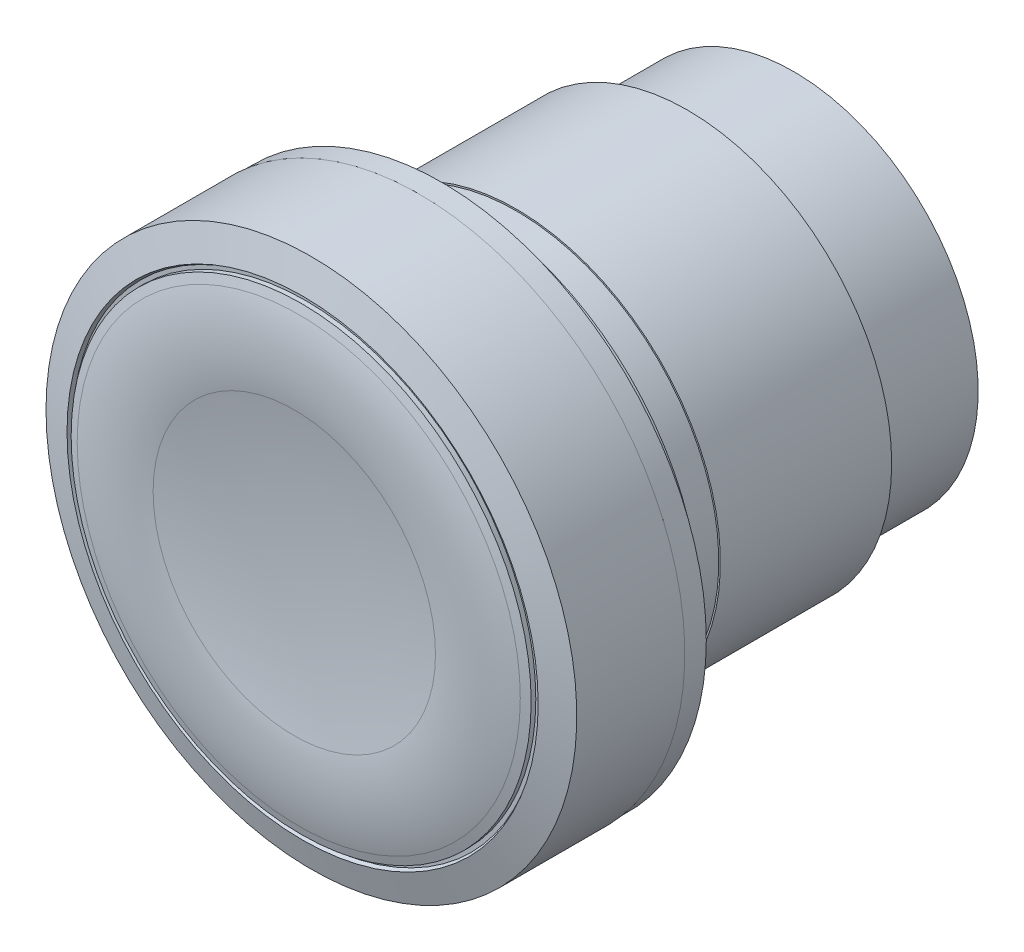
ISO-10303-21;
HEADER;
FILE_DESCRIPTION(('STEP AP214'),'2;1');
FILE_NAME('part.step','',(''),(''),'','','');
FILE_SCHEMA(('AUTOMOTIVE_DESIGN { 1 0 10303 214 1 1 1 1 }'));
ENDSEC;
DATA;
#1=APPLICATION_CONTEXT('core data for automotive mechanical design processes');
#2=APPLICATION_PROTOCOL_DEFINITION('international standard','automotive_design',2000,#1);
#3=PRODUCT_CONTEXT('',#1,'mechanical');
#4=PRODUCT('Part','Part','',(#3));
#5=PRODUCT_RELATED_PRODUCT_CATEGORY('part','',(#4));
#6=PRODUCT_DEFINITION_FORMATION('','',#4);
#7=PRODUCT_DEFINITION_CONTEXT('part definition',#1,'design');
#8=PRODUCT_DEFINITION('design','',#6,#7);
#9=PRODUCT_DEFINITION_SHAPE('','',#8);
#10=(LENGTH_UNIT() NAMED_UNIT(*) SI_UNIT(.MILLI.,.METRE.));
#11=(NAMED_UNIT(*) PLANE_ANGLE_UNIT() SI_UNIT($,.RADIAN.));
#12=(NAMED_UNIT(*) SI_UNIT($,.STERADIAN.) SOLID_ANGLE_UNIT());
#13=UNCERTAINTY_MEASURE_WITH_UNIT(LENGTH_MEASURE(1.E-05),#10,'distance_accuracy_value','');
#14=(GEOMETRIC_REPRESENTATION_CONTEXT(3) GLOBAL_UNCERTAINTY_ASSIGNED_CONTEXT((#13)) GLOBAL_UNIT_ASSIGNED_CONTEXT((#10,
#11,#12)) REPRESENTATION_CONTEXT('',''));
#15=CARTESIAN_POINT('',(0.,0.,0.));
#16=DIRECTION('',(0.,0.,1.));
#17=DIRECTION('',(1.,0.,0.));
#18=AXIS2_PLACEMENT_3D('',#15,#16,#17);
#19=CARTESIAN_POINT('',(0.,0.,55.10166666667));
#20=DIRECTION('',(0.80493777823147,0.306864365997268,0.507847845379776));
#21=DIRECTION('',(-0.389578542846218,0.918887200722201,0.0622484642600483));
#22=AXIS2_PLACEMENT_3D('',#19,#20,#21);
#23=SPHERICAL_SURFACE('',#22,46.8016666666641);
#24=CARTESIAN_POINT('',(5.29440814195972E-11,0.,8.91796162085043));
#25=DIRECTION('',(1.62594657119908E-12,0.,1.));
#26=DIRECTION('',(1.,0.,-1.62594657119908E-12));
#27=AXIS2_PLACEMENT_3D('',#24,#25,#26);
#28=CIRCLE('',#27,7.58032921569233);
#29=CARTESIAN_POINT('',(7.58032921574527,0.,8.9179616208381));
#30=VERTEX_POINT('',#29);
#31=EDGE_CURVE('E46',#30,#30,#28,.F.);
#32=ORIENTED_EDGE('',*,*,#31,.F.);
#33=EDGE_LOOP('',(#32));
#34=FACE_BOUND('',#33,.T.);
#35=ADVANCED_FACE('F15',(#34),#23,.F.);
#36=CARTESIAN_POINT('',(3.68993030575027E-11,0.,-0.94999999996839));
#37=DIRECTION('',(1.62594657119908E-12,0.,1.));
#38=DIRECTION('',(1.,0.,-1.62594657119908E-12));
#39=AXIS2_PLACEMENT_3D('',#36,#37,#38);
#40=DEGENERATE_TOROIDAL_SURFACE('',#39,9.19999999999285,9.99999999997349,.T.);
#41=ORIENTED_EDGE('',*,*,#31,.T.);
#42=EDGE_LOOP('',(#41));
#43=FACE_BOUND('',#42,.T.);
#44=CARTESIAN_POINT('',(5.25563618234636E-11,0.,8.67975358690508));
#45=DIRECTION('',(-1.62608815301724E-12,0.,-1.));
#46=DIRECTION('',(-1.,0.,1.62609897663112E-12));
#47=AXIS2_PLACEMENT_3D('',#44,#45,#46);
#48=CIRCLE('',#47,11.8958942589665);
#49=CARTESIAN_POINT('',(-11.8958942589139,0.,8.67975358692442));
#50=VERTEX_POINT('',#49);
#51=EDGE_CURVE('E43',#50,#50,#48,.T.);
#52=ORIENTED_EDGE('',*,*,#51,.F.);
#53=EDGE_LOOP('',(#52));
#54=FACE_BOUND('',#53,.T.);
#55=ADVANCED_FACE('F17',(#43,#54),#40,.T.);
#56=CARTESIAN_POINT('',(5.23452808876002E-11,0.,8.55000000000001));
#57=DIRECTION('',(-1.62600477391964E-12,0.,-1.));
#58=DIRECTION('',(-1.,0.,1.62600477391964E-12));
#59=AXIS2_PLACEMENT_3D('',#56,#57,#58);
#60=CONICAL_SURFACE('',#59,12.35,1.2924781623532);
#61=ORIENTED_EDGE('',*,*,#51,.T.);
#62=EDGE_LOOP('',(#61));
#63=FACE_BOUND('',#62,.T.);
#64=CARTESIAN_POINT('',(5.23453710529858E-11,0.,8.55));
#65=DIRECTION('',(-1.62608815301724E-12,0.,-1.));
#66=DIRECTION('',(-1.,0.,1.62608815301724E-12));
#67=AXIS2_PLACEMENT_3D('',#64,#65,#66);
#68=CIRCLE('',#67,12.35);
#69=CARTESIAN_POINT('',(-12.3499999999477,0.,8.55000000002008));
#70=VERTEX_POINT('',#69);
#71=EDGE_CURVE('E39',#70,#70,#68,.T.);
#72=ORIENTED_EDGE('',*,*,#71,.F.);
#73=EDGE_LOOP('',(#72));
#74=FACE_BOUND('',#73,.T.);
#75=ADVANCED_FACE('F52',(#63,#74),#60,.T.);
#76=CARTESIAN_POINT('',(5.14510225688263E-11,0.,8.));
#77=DIRECTION('',(-1.62608815301724E-12,0.,-1.));
#78=DIRECTION('',(-1.,0.,1.62608815301724E-12));
#79=AXIS2_PLACEMENT_3D('',#76,#77,#78);
#80=CYLINDRICAL_SURFACE('',#79,12.35);
#81=CARTESIAN_POINT('',(5.19388490147315E-11,0.,8.3));
#82=DIRECTION('',(-1.62608815301724E-12,0.,-1.));
#83=DIRECTION('',(-1.,0.,1.62608815301724E-12));
#84=AXIS2_PLACEMENT_3D('',#81,#82,#83);
#85=CIRCLE('',#84,12.35);
#86=CARTESIAN_POINT('',(-12.3499999999481,0.,8.30000000002009));
#87=VERTEX_POINT('',#86);
#88=EDGE_CURVE('E42',#87,#87,#85,.F.);
#89=ORIENTED_EDGE('',*,*,#88,.T.);
#90=EDGE_LOOP('',(#89));
#91=FACE_BOUND('',#90,.T.);
#92=ORIENTED_EDGE('',*,*,#71,.T.);
#93=EDGE_LOOP('',(#92));
#94=FACE_BOUND('',#93,.T.);
#95=ADVANCED_FACE('F55',(#91,#94),#80,.T.);
#96=CARTESIAN_POINT('',(0.,12.55,8.3));
#97=DIRECTION('',(-1.62608815301724E-12,0.,-1.));
#98=DIRECTION('',(-1.,0.,1.62608815301724E-12));
#99=AXIS2_PLACEMENT_3D('',#96,#97,#98);
#100=PLANE('',#99);
#101=CARTESIAN_POINT('',(5.19386820514745E-11,0.,8.29999999999998));
#102=DIRECTION('',(1.62608857661747E-12,0.,1.));
#103=DIRECTION('',(1.,0.,-1.62608857661747E-12));
#104=AXIS2_PLACEMENT_3D('',#101,#102,#103);
#105=CIRCLE('',#104,12.55);
#106=CARTESIAN_POINT('',(12.5500000000519,0.,8.29999999997957));
#107=VERTEX_POINT('',#106);
#108=EDGE_CURVE('E38',#107,#107,#105,.T.);
#109=ORIENTED_EDGE('',*,*,#108,.T.);
#110=EDGE_LOOP('',(#109));
#111=FACE_BOUND('',#110,.T.);
#112=ORIENTED_EDGE('',*,*,#88,.F.);
#113=EDGE_LOOP('',(#112));
#114=FACE_BOUND('',#113,.T.);
#115=ADVANCED_FACE('F59',(#111,#114),#100,.F.);
#116=CARTESIAN_POINT('',(5.22195134355918E-11,0.,8.47270362030429));
#117=DIRECTION('',(1.62608857661747E-12,0.,1.));
#118=DIRECTION('',(1.,0.,-1.62608857661747E-12));
#119=AXIS2_PLACEMENT_3D('',#116,#117,#118);
#120=CONICAL_SURFACE('',#119,12.6491364310812,0.52110225809177);
#121=CARTESIAN_POINT('',(5.22196803256915E-11,0.,8.47270362030429));
#122=DIRECTION('',(-1.62608815301724E-12,0.,-1.));
#123=DIRECTION('',(-1.,0.,1.62608857661747E-12));
#124=AXIS2_PLACEMENT_3D('',#121,#122,#123);
#125=CIRCLE('',#124,12.6491364310812);
#126=CARTESIAN_POINT('',(-12.649136431029,0.,8.47270362032486));
#127=VERTEX_POINT('',#126);
#128=EDGE_CURVE('E35',#127,#127,#125,.T.);
#129=ORIENTED_EDGE('',*,*,#128,.F.);
#130=EDGE_LOOP('',(#129));
#131=FACE_BOUND('',#130,.T.);
#132=ORIENTED_EDGE('',*,*,#108,.F.);
#133=EDGE_LOOP('',(#132));
#134=FACE_BOUND('',#133,.T.);
#135=ADVANCED_FACE('F63',(#131,#134),#120,.F.);
#136=CARTESIAN_POINT('',(5.14510309357341E-11,0.,7.99999999999998));
#137=DIRECTION('',(-1.62613587312969E-12,0.,-1.));
#138=DIRECTION('',(-1.,0.,1.62613587312969E-12));
#139=AXIS2_PLACEMENT_3D('',#136,#137,#138);
#140=CONICAL_SURFACE('',#139,14.2500000000001,1.28367505358618);
#141=ORIENTED_EDGE('',*,*,#128,.T.);
#142=EDGE_LOOP('',(#141));
#143=FACE_BOUND('',#142,.T.);
#144=CARTESIAN_POINT('',(5.14510225688263E-11,0.,8.));
#145=DIRECTION('',(-1.62608815301724E-12,0.,-1.));
#146=DIRECTION('',(-1.,0.,1.62608815301724E-12));
#147=AXIS2_PLACEMENT_3D('',#144,#145,#146);
#148=CIRCLE('',#147,14.25);
#149=CARTESIAN_POINT('',(-14.2499999999485,0.,8.00000000002317));
#150=VERTEX_POINT('',#149);
#151=EDGE_CURVE('E31',#150,#150,#148,.T.);
#152=ORIENTED_EDGE('',*,*,#151,.F.);
#153=EDGE_LOOP('',(#152));
#154=FACE_BOUND('',#153,.T.);
#155=ADVANCED_FACE('F67',(#143,#154),#140,.T.);
#156=CARTESIAN_POINT('',(5.14510225688263E-11,0.,8.));
#157=DIRECTION('',(-1.62608815301724E-12,0.,-1.));
#158=DIRECTION('',(-1.,0.,1.62608815301724E-12));
#159=AXIS2_PLACEMENT_3D('',#156,#157,#158);
#160=CYLINDRICAL_SURFACE('',#159,14.25);
#161=CARTESIAN_POINT('',(4.20197112813263E-11,0.,2.2));
#162=DIRECTION('',(-1.62608815301724E-12,0.,-1.));
#163=DIRECTION('',(-1.,0.,1.62608815301724E-12));
#164=AXIS2_PLACEMENT_3D('',#161,#162,#163);
#165=CIRCLE('',#164,14.25);
#166=CARTESIAN_POINT('',(-14.249999999958,0.,2.20000000002317));
#167=VERTEX_POINT('',#166);
#168=EDGE_CURVE('E34',#167,#167,#165,.F.);
#169=ORIENTED_EDGE('',*,*,#168,.T.);
#170=EDGE_LOOP('',(#169));
#171=FACE_BOUND('',#170,.T.);
#172=ORIENTED_EDGE('',*,*,#151,.T.);
#173=EDGE_LOOP('',(#172));
#174=FACE_BOUND('',#173,.T.);
#175=ADVANCED_FACE('F71',(#171,#174),#160,.T.);
#176=CARTESIAN_POINT('',(0.,14.21126313879,2.2));
#177=DIRECTION('',(0.,0.,1.));
#178=DIRECTION('',(0.,-1.,0.));
#179=AXIS2_PLACEMENT_3D('',#176,#177,#178);
#180=PLANE('',#179);
#181=CARTESIAN_POINT('',(4.20193393968482E-11,0.,2.2000000000002));
#182=DIRECTION('',(1.62608241636736E-12,0.,1.));
#183=DIRECTION('',(1.,0.,-1.62608241636736E-12));
#184=AXIS2_PLACEMENT_3D('',#181,#182,#183);
#185=CIRCLE('',#184,14.21126313879);
#186=CARTESIAN_POINT('',(14.211263138832,0.,2.19999999997709));
#187=VERTEX_POINT('',#186);
#188=EDGE_CURVE('E166',#187,#187,#185,.F.);
#189=ORIENTED_EDGE('',*,*,#188,.F.);
#190=EDGE_LOOP('',(#189));
#191=FACE_BOUND('',#190,.T.);
#192=ORIENTED_EDGE('',*,*,#168,.F.);
#193=EDGE_LOOP('',(#192));
#194=FACE_BOUND('',#193,.T.);
#195=ADVANCED_FACE('F75',(#191,#194),#180,.F.);
#196=CARTESIAN_POINT('',(4.20193393968482E-11,0.,2.20000000000023));
#197=DIRECTION('',(1.62608241636736E-12,0.,1.));
#198=DIRECTION('',(1.,0.,-1.62608241636736E-12));
#199=AXIS2_PLACEMENT_3D('',#196,#197,#198);
#200=CONICAL_SURFACE('',#199,14.21126313879,0.00678911009972162);
#201=CARTESIAN_POINT('',(4.00680404972068E-11,0.,0.99999999999989));
#202=DIRECTION('',(1.62608241636736E-12,0.,1.));
#203=DIRECTION('',(1.,0.,-1.62608241636736E-12));
#204=AXIS2_PLACEMENT_3D('',#201,#202,#203);
#205=CIRCLE('',#204,14.2031160814985);
#206=CARTESIAN_POINT('',(14.2031160815386,0.,0.999999999976794));
#207=VERTEX_POINT('',#206);
#208=EDGE_CURVE('E163',#207,#207,#205,.T.);
#209=ORIENTED_EDGE('',*,*,#208,.T.);
#210=EDGE_LOOP('',(#209));
#211=FACE_BOUND('',#210,.T.);
#212=ORIENTED_EDGE('',*,*,#188,.T.);
#213=EDGE_LOOP('',(#212));
#214=FACE_BOUND('',#213,.T.);
#215=ADVANCED_FACE('F79',(#211,#214),#200,.T.);
#216=CARTESIAN_POINT('',(0.,0.,-17.9000689388445));
#217=DIRECTION('',(0.,0.,1.));
#218=DIRECTION('',(0.,-1.,0.));
#219=AXIS2_PLACEMENT_3D('',#216,#217,#218);
#220=PLANE('',#219);
#221=CARTESIAN_POINT('',(9.33522730504146E-12,0.,-17.9000689388445));
#222=DIRECTION('',(-1.62608815301724E-12,0.,-1.));
#223=DIRECTION('',(-1.,0.,1.62608815301724E-12));
#224=AXIS2_PLACEMENT_3D('',#221,#222,#223);
#225=CIRCLE('',#224,9.90146535595912);
#226=CARTESIAN_POINT('',(-9.90146535594979,0.,-17.9000689388284));
#227=VERTEX_POINT('',#226);
#228=EDGE_CURVE('E160',#227,#227,#225,.F.);
#229=ORIENTED_EDGE('',*,*,#228,.F.);
#230=EDGE_LOOP('',(#229));
#231=FACE_BOUND('',#230,.T.);
#232=ADVANCED_FACE('F83',(#231),#220,.F.);
#233=CARTESIAN_POINT('',(0.,12.6,0.999999999999999));
#234=DIRECTION('',(0.,0.,1.));
#235=DIRECTION('',(0.,-1.,0.));
#236=AXIS2_PLACEMENT_3D('',#233,#234,#235);
#237=PLANE('',#236);
#238=CARTESIAN_POINT('',(4.00684054977056E-11,0.,1.));
#239=DIRECTION('',(-1.62608815301724E-12,0.,-1.));
#240=DIRECTION('',(-1.,0.,1.62608815301724E-12));
#241=AXIS2_PLACEMENT_3D('',#238,#239,#240);
#242=CIRCLE('',#241,12.6);
#243=CARTESIAN_POINT('',(-12.5999999999599,0.,1.00000000002049));
#244=VERTEX_POINT('',#243);
#245=EDGE_CURVE('E157',#244,#244,#242,.T.);
#246=ORIENTED_EDGE('',*,*,#245,.F.);
#247=EDGE_LOOP('',(#246));
#248=FACE_BOUND('',#247,.T.);
#249=ORIENTED_EDGE('',*,*,#208,.F.);
#250=EDGE_LOOP('',(#249));
#251=FACE_BOUND('',#250,.T.);
#252=ADVANCED_FACE('F87',(#248,#251),#237,.F.);
#253=CARTESIAN_POINT('',(5.14510225688263E-11,0.,8.));
#254=DIRECTION('',(-1.62608815301724E-12,0.,-1.));
#255=DIRECTION('',(-1.,0.,1.62608815301724E-12));
#256=AXIS2_PLACEMENT_3D('',#253,#254,#255);
#257=CYLINDRICAL_SURFACE('',#256,9.90146535595912);
#258=ORIENTED_EDGE('',*,*,#228,.T.);
#259=EDGE_LOOP('',(#258));
#260=FACE_BOUND('',#259,.T.);
#261=CARTESIAN_POINT('',(1.77584760383091E-11,0.,-12.72));
#262=DIRECTION('',(-1.62608815301724E-12,0.,-1.));
#263=DIRECTION('',(-1.,0.,1.62608815301724E-12));
#264=AXIS2_PLACEMENT_3D('',#261,#262,#263);
#265=CIRCLE('',#264,9.90146535595912);
#266=CARTESIAN_POINT('',(-9.90146535594136,0.,-12.7199999999839));
#267=VERTEX_POINT('',#266);
#268=EDGE_CURVE('E154',#267,#267,#265,.T.);
#269=ORIENTED_EDGE('',*,*,#268,.T.);
#270=EDGE_LOOP('',(#269));
#271=FACE_BOUND('',#270,.T.);
#272=ADVANCED_FACE('F91',(#260,#271),#257,.T.);
#273=CARTESIAN_POINT('',(5.14510225688263E-11,0.,8.));
#274=DIRECTION('',(-1.62608815301724E-12,0.,-1.));
#275=DIRECTION('',(-1.,0.,1.62608815301724E-12));
#276=AXIS2_PLACEMENT_3D('',#273,#274,#275);
#277=CYLINDRICAL_SURFACE('',#276,12.6);
#278=CARTESIAN_POINT('',(3.80357953064341E-11,0.,-0.25));
#279=DIRECTION('',(-1.62608815301724E-12,0.,-1.));
#280=DIRECTION('',(-1.,0.,1.62608815301724E-12));
#281=AXIS2_PLACEMENT_3D('',#278,#279,#280);
#282=CIRCLE('',#281,12.6);
#283=CARTESIAN_POINT('',(-12.599999999962,0.,-0.249999999979512));
#284=VERTEX_POINT('',#283);
#285=EDGE_CURVE('E151',#284,#284,#282,.F.);
#286=ORIENTED_EDGE('',*,*,#285,.T.);
#287=EDGE_LOOP('',(#286));
#288=FACE_BOUND('',#287,.T.);
#289=ORIENTED_EDGE('',*,*,#245,.T.);
#290=EDGE_LOOP('',(#289));
#291=FACE_BOUND('',#290,.T.);
#292=ADVANCED_FACE('F95',(#288,#291),#277,.T.);
#293=CARTESIAN_POINT('',(0.,9.90159274958611,-12.72));
#294=DIRECTION('',(0.,0.,1.));
#295=DIRECTION('',(0.,-1.,0.));
#296=AXIS2_PLACEMENT_3D('',#293,#294,#295);
#297=PLANE('',#296);
#298=ORIENTED_EDGE('',*,*,#268,.F.);
#299=EDGE_LOOP('',(#298));
#300=FACE_BOUND('',#299,.T.);
#301=CARTESIAN_POINT('',(1.7758476038309E-11,0.,-12.72));
#302=DIRECTION('',(-1.62608815301724E-12,0.,-1.));
#303=DIRECTION('',(-1.,0.,1.62608815301724E-12));
#304=AXIS2_PLACEMENT_3D('',#301,#302,#303);
#305=CIRCLE('',#304,10.);
#306=CARTESIAN_POINT('',(-9.99999999998224,0.,-12.7199999999838));
#307=VERTEX_POINT('',#306);
#308=EDGE_CURVE('E148',#307,#307,#305,.F.);
#309=ORIENTED_EDGE('',*,*,#308,.F.);
#310=EDGE_LOOP('',(#309));
#311=FACE_BOUND('',#310,.T.);
#312=ADVANCED_FACE('F99',(#300,#311),#297,.F.);
#313=CARTESIAN_POINT('',(0.,10.875,-0.250000000000001));
#314=DIRECTION('',(0.,0.,1.));
#315=DIRECTION('',(0.,-1.,0.));
#316=AXIS2_PLACEMENT_3D('',#313,#314,#315);
#317=PLANE('',#316);
#318=CARTESIAN_POINT('',(3.80357953064341E-11,0.,-0.25));
#319=DIRECTION('',(-1.62608815301724E-12,0.,-1.));
#320=DIRECTION('',(-1.,0.,1.62608815301724E-12));
#321=AXIS2_PLACEMENT_3D('',#318,#319,#320);
#322=CIRCLE('',#321,10.875);
#323=CARTESIAN_POINT('',(-10.874999999962,0.,-0.249999999982317));
#324=VERTEX_POINT('',#323);
#325=EDGE_CURVE('E143',#324,#324,#322,.T.);
#326=ORIENTED_EDGE('',*,*,#325,.F.);
#327=EDGE_LOOP('',(#326));
#328=FACE_BOUND('',#327,.T.);
#329=ORIENTED_EDGE('',*,*,#285,.F.);
#330=EDGE_LOOP('',(#329));
#331=FACE_BOUND('',#330,.T.);
#332=ADVANCED_FACE('F103',(#328,#331),#317,.F.);
#333=CARTESIAN_POINT('',(5.14510225688263E-11,0.,8.));
#334=DIRECTION('',(-1.62608815301724E-12,0.,-1.));
#335=DIRECTION('',(-1.,0.,1.62608815301724E-12));
#336=AXIS2_PLACEMENT_3D('',#333,#334,#335);
#337=CYLINDRICAL_SURFACE('',#336,10.);
#338=ORIENTED_EDGE('',*,*,#308,.T.);
#339=EDGE_LOOP('',(#338));
#340=FACE_BOUND('',#339,.T.);
#341=CARTESIAN_POINT('',(1.82788242472746E-11,0.,-12.4));
#342=DIRECTION('',(-1.62608815301724E-12,0.,-1.));
#343=DIRECTION('',(-1.,0.,1.62608815301724E-12));
#344=AXIS2_PLACEMENT_3D('',#341,#342,#343);
#345=CIRCLE('',#344,10.);
#346=CARTESIAN_POINT('',(-9.99999999998172,0.,-12.3999999999837));
#347=VERTEX_POINT('',#346);
#348=EDGE_CURVE('E139',#347,#347,#345,.T.);
#349=ORIENTED_EDGE('',*,*,#348,.T.);
#350=EDGE_LOOP('',(#349));
#351=FACE_BOUND('',#350,.T.);
#352=ADVANCED_FACE('F107',(#340,#351),#337,.T.);
#353=CARTESIAN_POINT('',(5.14510225688263E-11,0.,8.));
#354=DIRECTION('',(-1.62608815301724E-12,0.,-1.));
#355=DIRECTION('',(-1.,0.,1.62608815301724E-12));
#356=AXIS2_PLACEMENT_3D('',#353,#354,#355);
#357=CYLINDRICAL_SURFACE('',#356,10.875);
#358=CARTESIAN_POINT('',(3.35640528856367E-11,0.,-3.));
#359=DIRECTION('',(-1.62608815301724E-12,0.,-1.));
#360=DIRECTION('',(-1.,0.,1.62608815301724E-12));
#361=AXIS2_PLACEMENT_3D('',#358,#359,#360);
#362=CIRCLE('',#361,10.875);
#363=CARTESIAN_POINT('',(-10.8749999999664,0.,-2.99999999998231));
#364=VERTEX_POINT('',#363);
#365=EDGE_CURVE('E138',#364,#364,#362,.F.);
#366=ORIENTED_EDGE('',*,*,#365,.T.);
#367=EDGE_LOOP('',(#366));
#368=FACE_BOUND('',#367,.T.);
#369=ORIENTED_EDGE('',*,*,#325,.T.);
#370=EDGE_LOOP('',(#369));
#371=FACE_BOUND('',#370,.T.);
#372=ADVANCED_FACE('F111',(#368,#371),#357,.T.);
#373=CARTESIAN_POINT('',(0.,10.,-12.4));
#374=DIRECTION('',(0.,0.,1.));
#375=DIRECTION('',(0.,-1.,0.));
#376=AXIS2_PLACEMENT_3D('',#373,#374,#375);
#377=PLANE('',#376);
#378=ORIENTED_EDGE('',*,*,#348,.F.);
#379=EDGE_LOOP('',(#378));
#380=FACE_BOUND('',#379,.T.);
#381=CARTESIAN_POINT('',(1.82789987267977E-11,0.,-12.4));
#382=DIRECTION('',(1.62596969888535E-12,0.,1.));
#383=DIRECTION('',(1.,0.,-1.62596969888535E-12));
#384=AXIS2_PLACEMENT_3D('',#381,#382,#383);
#385=CIRCLE('',#384,10.19083411699);
#386=CARTESIAN_POINT('',(10.1908341170083,0.,-12.4000000000166));
#387=VERTEX_POINT('',#386);
#388=EDGE_CURVE('E28',#387,#387,#385,.T.);
#389=ORIENTED_EDGE('',*,*,#388,.F.);
#390=EDGE_LOOP('',(#389));
#391=FACE_BOUND('',#390,.T.);
#392=ADVANCED_FACE('F115',(#380,#391),#377,.F.);
#393=CARTESIAN_POINT('',(0.,10.96118150566,-3.));
#394=DIRECTION('',(-1.62608815301724E-12,0.,-1.));
#395=DIRECTION('',(-1.,0.,1.62608815301724E-12));
#396=AXIS2_PLACEMENT_3D('',#393,#394,#395);
#397=PLANE('',#396);
#398=CARTESIAN_POINT('',(3.35640528856367E-11,0.,-3.));
#399=DIRECTION('',(-1.62608815301724E-12,0.,-1.));
#400=DIRECTION('',(-1.,0.,1.62608815301724E-12));
#401=AXIS2_PLACEMENT_3D('',#398,#399,#400);
#402=CIRCLE('',#401,10.96118150566);
#403=CARTESIAN_POINT('',(-10.9611815056264,0.,-2.99999999998217));
#404=VERTEX_POINT('',#403);
#405=EDGE_CURVE('E23',#404,#404,#402,.T.);
#406=ORIENTED_EDGE('',*,*,#405,.F.);
#407=EDGE_LOOP('',(#406));
#408=FACE_BOUND('',#407,.T.);
#409=ORIENTED_EDGE('',*,*,#365,.F.);
#410=EDGE_LOOP('',(#409));
#411=FACE_BOUND('',#410,.T.);
#412=ADVANCED_FACE('F119',(#408,#411),#397,.F.);
#413=CARTESIAN_POINT('',(1.86101134502792E-11,0.,-12.19635861375));
#414=DIRECTION('',(1.62596969888535E-12,0.,1.));
#415=DIRECTION('',(1.,0.,-1.62596969888535E-12));
#416=AXIS2_PLACEMENT_3D('',#413,#414,#415);
#417=CONICAL_SURFACE('',#416,10.96118150566,1.3123579773335);
#418=ORIENTED_EDGE('',*,*,#388,.T.);
#419=EDGE_LOOP('',(#418));
#420=FACE_BOUND('',#419,.T.);
#421=CARTESIAN_POINT('',(1.86099630929197E-11,0.,-12.19635861375));
#422=DIRECTION('',(-1.62608815301724E-12,0.,-1.));
#423=DIRECTION('',(-1.,0.,1.62608815301724E-12));
#424=AXIS2_PLACEMENT_3D('',#421,#422,#423);
#425=CIRCLE('',#424,10.96118150566);
#426=CARTESIAN_POINT('',(-10.9611815056414,0.,-12.1963586137322));
#427=VERTEX_POINT('',#426);
#428=EDGE_CURVE('E9',#427,#427,#425,.F.);
#429=ORIENTED_EDGE('',*,*,#428,.F.);
#430=EDGE_LOOP('',(#429));
#431=FACE_BOUND('',#430,.T.);
#432=ADVANCED_FACE('F123',(#420,#431),#417,.T.);
#433=CARTESIAN_POINT('',(5.14510225688263E-11,0.,8.));
#434=DIRECTION('',(-1.62608815301724E-12,0.,-1.));
#435=DIRECTION('',(-1.,0.,1.62608815301724E-12));
#436=AXIS2_PLACEMENT_3D('',#433,#434,#435);
#437=CYLINDRICAL_SURFACE('',#436,10.96118150566);
#438=ORIENTED_EDGE('',*,*,#405,.T.);
#439=EDGE_LOOP('',(#438));
#440=FACE_BOUND('',#439,.T.);
#441=ORIENTED_EDGE('',*,*,#428,.T.);
#442=EDGE_LOOP('',(#441));
#443=FACE_BOUND('',#442,.T.);
#444=ADVANCED_FACE('F127',(#440,#443),#437,.T.);
#445=CLOSED_SHELL('',(#35,#55,#75,#95,#115,#135,#155,#175,#195,#215,#232,#252,#272,#292,#312,
#332,#352,#372,#392,#412,#432,#444));
#446=MANIFOLD_SOLID_BREP('B1',#445);
#447=ADVANCED_BREP_SHAPE_REPRESENTATION('',(#18,#446),#14);
#448=SHAPE_DEFINITION_REPRESENTATION(#9,#447);
ENDSEC;
END-ISO-10303-21;
